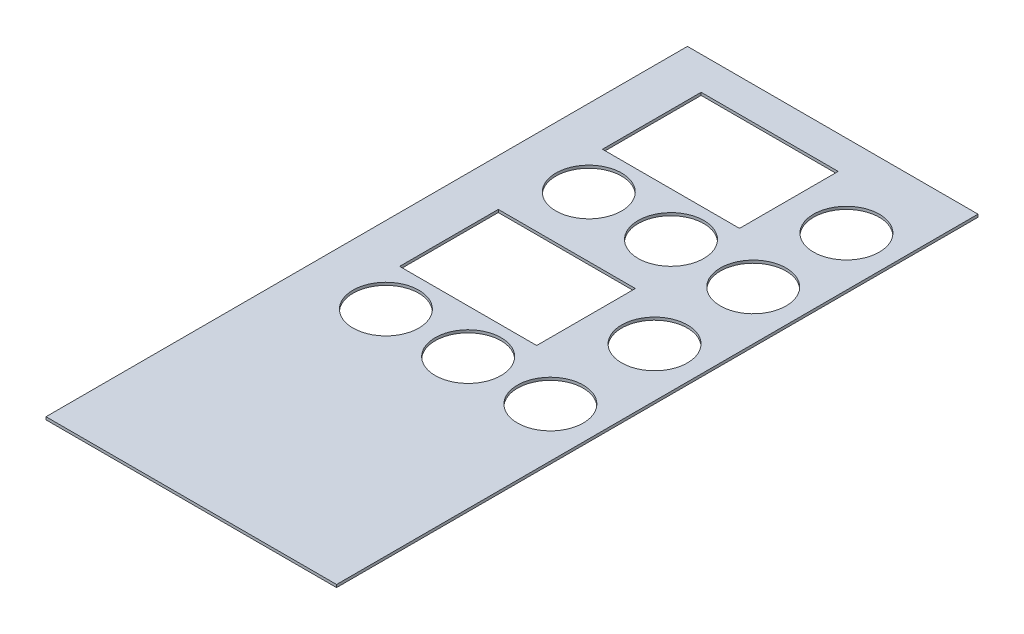
ISO-10303-21;
HEADER;
FILE_DESCRIPTION(('STEP AP214'),'2;1');
FILE_NAME('part.step','',(''),(''),'','','');
FILE_SCHEMA(('AUTOMOTIVE_DESIGN { 1 0 10303 214 1 1 1 1 }'));
ENDSEC;
DATA;
#1=APPLICATION_CONTEXT('core data for automotive mechanical design processes');
#2=APPLICATION_PROTOCOL_DEFINITION('international standard','automotive_design',2000,#1);
#3=PRODUCT_CONTEXT('',#1,'mechanical');
#4=PRODUCT('Part','Part','',(#3));
#5=PRODUCT_RELATED_PRODUCT_CATEGORY('part','',(#4));
#6=PRODUCT_DEFINITION_FORMATION('','',#4);
#7=PRODUCT_DEFINITION_CONTEXT('part definition',#1,'design');
#8=PRODUCT_DEFINITION('design','',#6,#7);
#9=PRODUCT_DEFINITION_SHAPE('','',#8);
#10=(LENGTH_UNIT() NAMED_UNIT(*) SI_UNIT(.MILLI.,.METRE.));
#11=(NAMED_UNIT(*) PLANE_ANGLE_UNIT() SI_UNIT($,.RADIAN.));
#12=(NAMED_UNIT(*) SI_UNIT($,.STERADIAN.) SOLID_ANGLE_UNIT());
#13=UNCERTAINTY_MEASURE_WITH_UNIT(LENGTH_MEASURE(1.E-05),#10,'distance_accuracy_value','');
#14=(GEOMETRIC_REPRESENTATION_CONTEXT(3) GLOBAL_UNCERTAINTY_ASSIGNED_CONTEXT((#13)) GLOBAL_UNIT_ASSIGNED_CONTEXT((#10,
#11,#12)) REPRESENTATION_CONTEXT('',''));
#15=CARTESIAN_POINT('',(0.,0.,0.));
#16=DIRECTION('',(0.,0.,1.));
#17=DIRECTION('',(1.,0.,0.));
#18=AXIS2_PLACEMENT_3D('',#15,#16,#17);
#19=CARTESIAN_POINT('',(26.5,0.5,58.5));
#20=DIRECTION('',(-1.,0.,0.));
#21=DIRECTION('',(0.,0.,1.));
#22=AXIS2_PLACEMENT_3D('',#19,#20,#21);
#23=PLANE('',#22);
#24=DIRECTION('',(0.,0.,-1.));
#25=VECTOR('',#24,1.);
#26=CARTESIAN_POINT('',(26.5,0.,58.5));
#27=LINE('',#26,#25);
#28=CARTESIAN_POINT('',(26.5,0.,58.5));
#29=VERTEX_POINT('',#28);
#30=CARTESIAN_POINT('',(26.5,0.,-58.5));
#31=VERTEX_POINT('',#30);
#32=EDGE_CURVE('E187',#29,#31,#27,.T.);
#33=ORIENTED_EDGE('',*,*,#32,.T.);
#34=DIRECTION('',(0.,-1.,0.));
#35=VECTOR('',#34,1.);
#36=CARTESIAN_POINT('',(26.5,0.5,-58.5));
#37=LINE('',#36,#35);
#38=CARTESIAN_POINT('',(26.5,0.5,-58.5));
#39=VERTEX_POINT('',#38);
#40=EDGE_CURVE('E11',#39,#31,#37,.T.);
#41=ORIENTED_EDGE('',*,*,#40,.F.);
#42=DIRECTION('',(0.,0.,-1.));
#43=VECTOR('',#42,1.);
#44=CARTESIAN_POINT('',(26.5,0.5,58.5));
#45=LINE('',#44,#43);
#46=CARTESIAN_POINT('',(26.5,0.5,58.5));
#47=VERTEX_POINT('',#46);
#48=EDGE_CURVE('E194',#47,#39,#45,.T.);
#49=ORIENTED_EDGE('',*,*,#48,.F.);
#50=DIRECTION('',(0.,-1.,0.));
#51=VECTOR('',#50,1.);
#52=CARTESIAN_POINT('',(26.5,0.5,58.5));
#53=LINE('',#52,#51);
#54=EDGE_CURVE('E204',#47,#29,#53,.T.);
#55=ORIENTED_EDGE('',*,*,#54,.T.);
#56=EDGE_LOOP('',(#33,#41,#49,#55));
#57=FACE_BOUND('',#56,.T.);
#58=ADVANCED_FACE('F33',(#57),#23,.F.);
#59=CARTESIAN_POINT('',(-26.5,0.5,-58.5));
#60=DIRECTION('',(0.,0.,1.));
#61=DIRECTION('',(1.,0.,0.));
#62=AXIS2_PLACEMENT_3D('',#59,#60,#61);
#63=PLANE('',#62);
#64=DIRECTION('',(-1.,0.,0.));
#65=VECTOR('',#64,1.);
#66=CARTESIAN_POINT('',(-26.5,0.,-58.5));
#67=LINE('',#66,#65);
#68=CARTESIAN_POINT('',(-26.5,0.,-58.5));
#69=VERTEX_POINT('',#68);
#70=EDGE_CURVE('E207',#31,#69,#67,.T.);
#71=ORIENTED_EDGE('',*,*,#70,.T.);
#72=DIRECTION('',(0.,-1.,0.));
#73=VECTOR('',#72,1.);
#74=CARTESIAN_POINT('',(-26.5,0.5,-58.5));
#75=LINE('',#74,#73);
#76=CARTESIAN_POINT('',(-26.5,0.5,-58.5));
#77=VERTEX_POINT('',#76);
#78=EDGE_CURVE('E40',#77,#69,#75,.T.);
#79=ORIENTED_EDGE('',*,*,#78,.F.);
#80=DIRECTION('',(-1.,0.,0.));
#81=VECTOR('',#80,1.);
#82=CARTESIAN_POINT('',(-26.5,0.5,-58.5));
#83=LINE('',#82,#81);
#84=EDGE_CURVE('E197',#39,#77,#83,.T.);
#85=ORIENTED_EDGE('',*,*,#84,.F.);
#86=ORIENTED_EDGE('',*,*,#40,.T.);
#87=EDGE_LOOP('',(#71,#79,#85,#86));
#88=FACE_BOUND('',#87,.T.);
#89=ADVANCED_FACE('F236',(#88),#63,.F.);
#90=CARTESIAN_POINT('',(-26.5,0.5,58.5));
#91=DIRECTION('',(1.,0.,0.));
#92=DIRECTION('',(0.,0.,-1.));
#93=AXIS2_PLACEMENT_3D('',#90,#91,#92);
#94=PLANE('',#93);
#95=DIRECTION('',(0.,0.,1.));
#96=VECTOR('',#95,1.);
#97=CARTESIAN_POINT('',(-26.5,0.,58.5));
#98=LINE('',#97,#96);
#99=CARTESIAN_POINT('',(-26.5,0.,58.5));
#100=VERTEX_POINT('',#99);
#101=EDGE_CURVE('E209',#69,#100,#98,.T.);
#102=ORIENTED_EDGE('',*,*,#101,.T.);
#103=DIRECTION('',(0.,-1.,0.));
#104=VECTOR('',#103,1.);
#105=CARTESIAN_POINT('',(-26.5,0.5,58.5));
#106=LINE('',#105,#104);
#107=CARTESIAN_POINT('',(-26.5,0.5,58.5));
#108=VERTEX_POINT('',#107);
#109=EDGE_CURVE('E214',#108,#100,#106,.T.);
#110=ORIENTED_EDGE('',*,*,#109,.F.);
#111=DIRECTION('',(0.,0.,1.));
#112=VECTOR('',#111,1.);
#113=CARTESIAN_POINT('',(-26.5,0.5,58.5));
#114=LINE('',#113,#112);
#115=EDGE_CURVE('E200',#77,#108,#114,.T.);
#116=ORIENTED_EDGE('',*,*,#115,.F.);
#117=ORIENTED_EDGE('',*,*,#78,.T.);
#118=EDGE_LOOP('',(#102,#110,#116,#117));
#119=FACE_BOUND('',#118,.T.);
#120=ADVANCED_FACE('F221',(#119),#94,.F.);
#121=CARTESIAN_POINT('',(-26.5,0.5,58.5));
#122=DIRECTION('',(0.,0.,-1.));
#123=DIRECTION('',(-1.,0.,0.));
#124=AXIS2_PLACEMENT_3D('',#121,#122,#123);
#125=PLANE('',#124);
#126=DIRECTION('',(1.,0.,0.));
#127=VECTOR('',#126,1.);
#128=CARTESIAN_POINT('',(-26.5,0.,58.5));
#129=LINE('',#128,#127);
#130=EDGE_CURVE('E198',#100,#29,#129,.T.);
#131=ORIENTED_EDGE('',*,*,#130,.T.);
#132=ORIENTED_EDGE('',*,*,#54,.F.);
#133=DIRECTION('',(1.,0.,0.));
#134=VECTOR('',#133,1.);
#135=CARTESIAN_POINT('',(-26.5,0.5,58.5));
#136=LINE('',#135,#134);
#137=EDGE_CURVE('E202',#108,#47,#136,.T.);
#138=ORIENTED_EDGE('',*,*,#137,.F.);
#139=ORIENTED_EDGE('',*,*,#109,.T.);
#140=EDGE_LOOP('',(#131,#132,#138,#139));
#141=FACE_BOUND('',#140,.T.);
#142=ADVANCED_FACE('F229',(#141),#125,.F.);
#143=CARTESIAN_POINT('',(26.5,0.5,-58.5));
#144=DIRECTION('',(0.,-1.,0.));
#145=DIRECTION('',(0.,0.,-1.));
#146=AXIS2_PLACEMENT_3D('',#143,#144,#145);
#147=PLANE('',#146);
#148=CARTESIAN_POINT('',(-12.5,0.5,10.5));
#149=DIRECTION('',(0.,1.,0.));
#150=DIRECTION('',(0.,0.,1.));
#151=AXIS2_PLACEMENT_3D('',#148,#149,#150);
#152=CIRCLE('',#151,6.);
#153=CARTESIAN_POINT('',(-12.5,0.5,16.5));
#154=VERTEX_POINT('',#153);
#155=EDGE_CURVE('E318',#154,#154,#152,.T.);
#156=ORIENTED_EDGE('',*,*,#155,.F.);
#157=EDGE_LOOP('',(#156));
#158=FACE_BOUND('',#157,.T.);
#159=CARTESIAN_POINT('',(2.50000000000001,0.5,10.5));
#160=DIRECTION('',(0.,1.,0.));
#161=DIRECTION('',(0.,0.,1.));
#162=AXIS2_PLACEMENT_3D('',#159,#160,#161);
#163=CIRCLE('',#162,6.);
#164=CARTESIAN_POINT('',(2.50000000000001,0.5,16.5));
#165=VERTEX_POINT('',#164);
#166=EDGE_CURVE('E320',#165,#165,#163,.T.);
#167=ORIENTED_EDGE('',*,*,#166,.F.);
#168=EDGE_LOOP('',(#167));
#169=FACE_BOUND('',#168,.T.);
#170=CARTESIAN_POINT('',(-12.5,0.5,-26.5));
#171=DIRECTION('',(0.,1.,0.));
#172=DIRECTION('',(0.,0.,1.));
#173=AXIS2_PLACEMENT_3D('',#170,#171,#172);
#174=CIRCLE('',#173,6.);
#175=CARTESIAN_POINT('',(-12.5,0.5,-20.5));
#176=VERTEX_POINT('',#175);
#177=EDGE_CURVE('E326',#176,#176,#174,.T.);
#178=ORIENTED_EDGE('',*,*,#177,.F.);
#179=EDGE_LOOP('',(#178));
#180=FACE_BOUND('',#179,.T.);
#181=CARTESIAN_POINT('',(2.50000000000001,0.5,-26.5));
#182=DIRECTION('',(0.,1.,0.));
#183=DIRECTION('',(0.,0.,1.));
#184=AXIS2_PLACEMENT_3D('',#181,#182,#183);
#185=CIRCLE('',#184,6.);
#186=CARTESIAN_POINT('',(2.50000000000001,0.5,-20.5));
#187=VERTEX_POINT('',#186);
#188=EDGE_CURVE('E332',#187,#187,#185,.T.);
#189=ORIENTED_EDGE('',*,*,#188,.F.);
#190=EDGE_LOOP('',(#189));
#191=FACE_BOUND('',#190,.T.);
#192=CARTESIAN_POINT('',(17.5,0.5,10.5));
#193=DIRECTION('',(0.,1.,0.));
#194=DIRECTION('',(0.,0.,1.));
#195=AXIS2_PLACEMENT_3D('',#192,#193,#194);
#196=CIRCLE('',#195,6.);
#197=CARTESIAN_POINT('',(17.5,0.5,16.5));
#198=VERTEX_POINT('',#197);
#199=EDGE_CURVE('E338',#198,#198,#196,.T.);
#200=ORIENTED_EDGE('',*,*,#199,.F.);
#201=EDGE_LOOP('',(#200));
#202=FACE_BOUND('',#201,.T.);
#203=CARTESIAN_POINT('',(17.5,0.5,-8.50000000000001));
#204=DIRECTION('',(0.,1.,0.));
#205=DIRECTION('',(0.,0.,1.));
#206=AXIS2_PLACEMENT_3D('',#203,#204,#205);
#207=CIRCLE('',#206,6.);
#208=CARTESIAN_POINT('',(17.5,0.5,-2.50000000000001));
#209=VERTEX_POINT('',#208);
#210=EDGE_CURVE('E344',#209,#209,#207,.T.);
#211=ORIENTED_EDGE('',*,*,#210,.F.);
#212=EDGE_LOOP('',(#211));
#213=FACE_BOUND('',#212,.T.);
#214=CARTESIAN_POINT('',(17.5,0.5,-26.5));
#215=DIRECTION('',(0.,1.,0.));
#216=DIRECTION('',(0.,0.,1.));
#217=AXIS2_PLACEMENT_3D('',#214,#215,#216);
#218=CIRCLE('',#217,6.);
#219=CARTESIAN_POINT('',(17.5,0.5,-20.5));
#220=VERTEX_POINT('',#219);
#221=EDGE_CURVE('E350',#220,#220,#218,.T.);
#222=ORIENTED_EDGE('',*,*,#221,.F.);
#223=EDGE_LOOP('',(#222));
#224=FACE_BOUND('',#223,.T.);
#225=CARTESIAN_POINT('',(17.5,0.5,-43.5));
#226=DIRECTION('',(0.,1.,0.));
#227=DIRECTION('',(0.,0.,1.));
#228=AXIS2_PLACEMENT_3D('',#225,#226,#227);
#229=CIRCLE('',#228,6.);
#230=CARTESIAN_POINT('',(17.5,0.5,-37.5));
#231=VERTEX_POINT('',#230);
#232=EDGE_CURVE('E145',#231,#231,#229,.T.);
#233=ORIENTED_EDGE('',*,*,#232,.F.);
#234=EDGE_LOOP('',(#233));
#235=FACE_BOUND('',#234,.T.);
#236=DIRECTION('',(-1.,0.,0.));
#237=VECTOR('',#236,1.);
#238=CARTESIAN_POINT('',(-18.,0.5,-15.5));
#239=LINE('',#238,#237);
#240=CARTESIAN_POINT('',(6.99999999999999,0.5,-15.5));
#241=VERTEX_POINT('',#240);
#242=CARTESIAN_POINT('',(-18.,0.5,-15.5));
#243=VERTEX_POINT('',#242);
#244=EDGE_CURVE('E151',#241,#243,#239,.T.);
#245=ORIENTED_EDGE('',*,*,#244,.F.);
#246=DIRECTION('',(0.,0.,-1.));
#247=VECTOR('',#246,1.);
#248=CARTESIAN_POINT('',(6.99999999999999,0.5,2.49999999999997));
#249=LINE('',#248,#247);
#250=CARTESIAN_POINT('',(6.99999999999999,0.5,2.49999999999997));
#251=VERTEX_POINT('',#250);
#252=EDGE_CURVE('E47',#251,#241,#249,.T.);
#253=ORIENTED_EDGE('',*,*,#252,.F.);
#254=DIRECTION('',(1.,0.,0.));
#255=VECTOR('',#254,1.);
#256=CARTESIAN_POINT('',(-18.,0.5,2.49999999999997));
#257=LINE('',#256,#255);
#258=CARTESIAN_POINT('',(-18.,0.5,2.49999999999997));
#259=VERTEX_POINT('',#258);
#260=EDGE_CURVE('E139',#259,#251,#257,.T.);
#261=ORIENTED_EDGE('',*,*,#260,.F.);
#262=DIRECTION('',(0.,0.,1.));
#263=VECTOR('',#262,1.);
#264=CARTESIAN_POINT('',(-18.,0.5,2.49999999999997));
#265=LINE('',#264,#263);
#266=EDGE_CURVE('E142',#243,#259,#265,.T.);
#267=ORIENTED_EDGE('',*,*,#266,.F.);
#268=EDGE_LOOP('',(#245,#253,#261,#267));
#269=FACE_BOUND('',#268,.T.);
#270=DIRECTION('',(-1.,0.,0.));
#271=VECTOR('',#270,1.);
#272=CARTESIAN_POINT('',(-18.,0.5,-52.5));
#273=LINE('',#272,#271);
#274=CARTESIAN_POINT('',(6.99999999999999,0.5,-52.5));
#275=VERTEX_POINT('',#274);
#276=CARTESIAN_POINT('',(-18.,0.5,-52.5));
#277=VERTEX_POINT('',#276);
#278=EDGE_CURVE('E177',#275,#277,#273,.T.);
#279=ORIENTED_EDGE('',*,*,#278,.F.);
#280=DIRECTION('',(0.,0.,-1.));
#281=VECTOR('',#280,1.);
#282=CARTESIAN_POINT('',(6.99999999999999,0.5,-52.5));
#283=LINE('',#282,#281);
#284=CARTESIAN_POINT('',(6.99999999999999,0.5,-34.5));
#285=VERTEX_POINT('',#284);
#286=EDGE_CURVE('E158',#285,#275,#283,.T.);
#287=ORIENTED_EDGE('',*,*,#286,.F.);
#288=DIRECTION('',(1.,0.,0.));
#289=VECTOR('',#288,1.);
#290=CARTESIAN_POINT('',(-18.,0.5,-34.5));
#291=LINE('',#290,#289);
#292=CARTESIAN_POINT('',(-18.,0.5,-34.5));
#293=VERTEX_POINT('',#292);
#294=EDGE_CURVE('E166',#293,#285,#291,.T.);
#295=ORIENTED_EDGE('',*,*,#294,.F.);
#296=DIRECTION('',(0.,0.,1.));
#297=VECTOR('',#296,1.);
#298=CARTESIAN_POINT('',(-18.,0.5,-52.5));
#299=LINE('',#298,#297);
#300=EDGE_CURVE('E180',#277,#293,#299,.T.);
#301=ORIENTED_EDGE('',*,*,#300,.F.);
#302=EDGE_LOOP('',(#279,#287,#295,#301));
#303=FACE_BOUND('',#302,.T.);
#304=ORIENTED_EDGE('',*,*,#48,.T.);
#305=ORIENTED_EDGE('',*,*,#84,.T.);
#306=ORIENTED_EDGE('',*,*,#115,.T.);
#307=ORIENTED_EDGE('',*,*,#137,.T.);
#308=EDGE_LOOP('',(#304,#305,#306,#307));
#309=FACE_BOUND('',#308,.T.);
#310=ADVANCED_FACE('F235',(#158,#169,#180,#191,#202,#213,#224,#235,#269,#303,#309),#147,.F.);
#311=CARTESIAN_POINT('',(26.5,0.,-58.5));
#312=DIRECTION('',(0.,-1.,0.));
#313=DIRECTION('',(0.,0.,-1.));
#314=AXIS2_PLACEMENT_3D('',#311,#312,#313);
#315=PLANE('',#314);
#316=CARTESIAN_POINT('',(-12.5,0.,10.5));
#317=DIRECTION('',(0.,1.,0.));
#318=DIRECTION('',(0.,0.,1.));
#319=AXIS2_PLACEMENT_3D('',#316,#317,#318);
#320=CIRCLE('',#319,6.);
#321=CARTESIAN_POINT('',(-12.5,0.,16.5));
#322=VERTEX_POINT('',#321);
#323=EDGE_CURVE('E315',#322,#322,#320,.T.);
#324=ORIENTED_EDGE('',*,*,#323,.T.);
#325=EDGE_LOOP('',(#324));
#326=FACE_BOUND('',#325,.T.);
#327=CARTESIAN_POINT('',(2.50000000000001,0.,10.5));
#328=DIRECTION('',(0.,1.,0.));
#329=DIRECTION('',(0.,0.,1.));
#330=AXIS2_PLACEMENT_3D('',#327,#328,#329);
#331=CIRCLE('',#330,6.);
#332=CARTESIAN_POINT('',(2.50000000000001,0.,16.5));
#333=VERTEX_POINT('',#332);
#334=EDGE_CURVE('E323',#333,#333,#331,.T.);
#335=ORIENTED_EDGE('',*,*,#334,.T.);
#336=EDGE_LOOP('',(#335));
#337=FACE_BOUND('',#336,.T.);
#338=CARTESIAN_POINT('',(-12.5,0.,-26.5));
#339=DIRECTION('',(0.,1.,0.));
#340=DIRECTION('',(0.,0.,1.));
#341=AXIS2_PLACEMENT_3D('',#338,#339,#340);
#342=CIRCLE('',#341,6.);
#343=CARTESIAN_POINT('',(-12.5,0.,-20.5));
#344=VERTEX_POINT('',#343);
#345=EDGE_CURVE('E329',#344,#344,#342,.T.);
#346=ORIENTED_EDGE('',*,*,#345,.T.);
#347=EDGE_LOOP('',(#346));
#348=FACE_BOUND('',#347,.T.);
#349=CARTESIAN_POINT('',(2.50000000000001,0.,-26.5));
#350=DIRECTION('',(0.,1.,0.));
#351=DIRECTION('',(0.,0.,1.));
#352=AXIS2_PLACEMENT_3D('',#349,#350,#351);
#353=CIRCLE('',#352,6.);
#354=CARTESIAN_POINT('',(2.50000000000001,0.,-20.5));
#355=VERTEX_POINT('',#354);
#356=EDGE_CURVE('E335',#355,#355,#353,.T.);
#357=ORIENTED_EDGE('',*,*,#356,.T.);
#358=EDGE_LOOP('',(#357));
#359=FACE_BOUND('',#358,.T.);
#360=CARTESIAN_POINT('',(17.5,0.,10.5));
#361=DIRECTION('',(0.,1.,0.));
#362=DIRECTION('',(0.,0.,1.));
#363=AXIS2_PLACEMENT_3D('',#360,#361,#362);
#364=CIRCLE('',#363,6.);
#365=CARTESIAN_POINT('',(17.5,0.,16.5));
#366=VERTEX_POINT('',#365);
#367=EDGE_CURVE('E341',#366,#366,#364,.T.);
#368=ORIENTED_EDGE('',*,*,#367,.T.);
#369=EDGE_LOOP('',(#368));
#370=FACE_BOUND('',#369,.T.);
#371=CARTESIAN_POINT('',(17.5,0.,-8.50000000000001));
#372=DIRECTION('',(0.,1.,0.));
#373=DIRECTION('',(0.,0.,1.));
#374=AXIS2_PLACEMENT_3D('',#371,#372,#373);
#375=CIRCLE('',#374,6.);
#376=CARTESIAN_POINT('',(17.5,0.,-2.50000000000001));
#377=VERTEX_POINT('',#376);
#378=EDGE_CURVE('E347',#377,#377,#375,.T.);
#379=ORIENTED_EDGE('',*,*,#378,.T.);
#380=EDGE_LOOP('',(#379));
#381=FACE_BOUND('',#380,.T.);
#382=CARTESIAN_POINT('',(17.5,0.,-26.5));
#383=DIRECTION('',(0.,1.,0.));
#384=DIRECTION('',(0.,0.,1.));
#385=AXIS2_PLACEMENT_3D('',#382,#383,#384);
#386=CIRCLE('',#385,6.);
#387=CARTESIAN_POINT('',(17.5,0.,-20.5));
#388=VERTEX_POINT('',#387);
#389=EDGE_CURVE('E353',#388,#388,#386,.T.);
#390=ORIENTED_EDGE('',*,*,#389,.T.);
#391=EDGE_LOOP('',(#390));
#392=FACE_BOUND('',#391,.T.);
#393=CARTESIAN_POINT('',(17.5,0.,-43.5));
#394=DIRECTION('',(0.,1.,0.));
#395=DIRECTION('',(0.,0.,1.));
#396=AXIS2_PLACEMENT_3D('',#393,#394,#395);
#397=CIRCLE('',#396,6.);
#398=CARTESIAN_POINT('',(17.5,0.,-37.5));
#399=VERTEX_POINT('',#398);
#400=EDGE_CURVE('E152',#399,#399,#397,.T.);
#401=ORIENTED_EDGE('',*,*,#400,.T.);
#402=EDGE_LOOP('',(#401));
#403=FACE_BOUND('',#402,.T.);
#404=DIRECTION('',(0.,0.,-1.));
#405=VECTOR('',#404,1.);
#406=CARTESIAN_POINT('',(6.99999999999999,0.,2.49999999999997));
#407=LINE('',#406,#405);
#408=CARTESIAN_POINT('',(6.99999999999999,0.,2.49999999999997));
#409=VERTEX_POINT('',#408);
#410=CARTESIAN_POINT('',(6.99999999999999,0.,-15.5));
#411=VERTEX_POINT('',#410);
#412=EDGE_CURVE('E123',#409,#411,#407,.T.);
#413=ORIENTED_EDGE('',*,*,#412,.T.);
#414=DIRECTION('',(-1.,0.,0.));
#415=VECTOR('',#414,1.);
#416=CARTESIAN_POINT('',(-18.,0.,-15.5));
#417=LINE('',#416,#415);
#418=CARTESIAN_POINT('',(-18.,0.,-15.5));
#419=VERTEX_POINT('',#418);
#420=EDGE_CURVE('E132',#411,#419,#417,.T.);
#421=ORIENTED_EDGE('',*,*,#420,.T.);
#422=DIRECTION('',(0.,0.,1.));
#423=VECTOR('',#422,1.);
#424=CARTESIAN_POINT('',(-18.,0.,2.49999999999997));
#425=LINE('',#424,#423);
#426=CARTESIAN_POINT('',(-18.,0.,2.49999999999997));
#427=VERTEX_POINT('',#426);
#428=EDGE_CURVE('E55',#419,#427,#425,.T.);
#429=ORIENTED_EDGE('',*,*,#428,.T.);
#430=DIRECTION('',(1.,0.,0.));
#431=VECTOR('',#430,1.);
#432=CARTESIAN_POINT('',(-18.,0.,2.49999999999997));
#433=LINE('',#432,#431);
#434=EDGE_CURVE('E129',#427,#409,#433,.T.);
#435=ORIENTED_EDGE('',*,*,#434,.T.);
#436=EDGE_LOOP('',(#413,#421,#429,#435));
#437=FACE_BOUND('',#436,.T.);
#438=DIRECTION('',(0.,0.,-1.));
#439=VECTOR('',#438,1.);
#440=CARTESIAN_POINT('',(6.99999999999999,0.,-52.5));
#441=LINE('',#440,#439);
#442=CARTESIAN_POINT('',(6.99999999999999,0.,-34.5));
#443=VERTEX_POINT('',#442);
#444=CARTESIAN_POINT('',(6.99999999999999,0.,-52.5));
#445=VERTEX_POINT('',#444);
#446=EDGE_CURVE('E162',#443,#445,#441,.T.);
#447=ORIENTED_EDGE('',*,*,#446,.T.);
#448=DIRECTION('',(-1.,0.,0.));
#449=VECTOR('',#448,1.);
#450=CARTESIAN_POINT('',(-18.,0.,-52.5));
#451=LINE('',#450,#449);
#452=CARTESIAN_POINT('',(-18.,0.,-52.5));
#453=VERTEX_POINT('',#452);
#454=EDGE_CURVE('E165',#445,#453,#451,.T.);
#455=ORIENTED_EDGE('',*,*,#454,.T.);
#456=DIRECTION('',(0.,0.,1.));
#457=VECTOR('',#456,1.);
#458=CARTESIAN_POINT('',(-18.,0.,-52.5));
#459=LINE('',#458,#457);
#460=CARTESIAN_POINT('',(-18.,0.,-34.5));
#461=VERTEX_POINT('',#460);
#462=EDGE_CURVE('E169',#453,#461,#459,.T.);
#463=ORIENTED_EDGE('',*,*,#462,.T.);
#464=DIRECTION('',(1.,0.,0.));
#465=VECTOR('',#464,1.);
#466=CARTESIAN_POINT('',(-18.,0.,-34.5));
#467=LINE('',#466,#465);
#468=EDGE_CURVE('E172',#461,#443,#467,.T.);
#469=ORIENTED_EDGE('',*,*,#468,.T.);
#470=EDGE_LOOP('',(#447,#455,#463,#469));
#471=FACE_BOUND('',#470,.T.);
#472=ORIENTED_EDGE('',*,*,#32,.F.);
#473=ORIENTED_EDGE('',*,*,#130,.F.);
#474=ORIENTED_EDGE('',*,*,#101,.F.);
#475=ORIENTED_EDGE('',*,*,#70,.F.);
#476=EDGE_LOOP('',(#472,#473,#474,#475));
#477=FACE_BOUND('',#476,.T.);
#478=ADVANCED_FACE('F136',(#326,#337,#348,#359,#370,#381,#392,#403,#437,#471,#477),#315,.T.);
#479=CARTESIAN_POINT('',(6.99999999999999,0.,-52.5));
#480=DIRECTION('',(1.,0.,0.));
#481=DIRECTION('',(0.,0.,-1.));
#482=AXIS2_PLACEMENT_3D('',#479,#480,#481);
#483=PLANE('',#482);
#484=ORIENTED_EDGE('',*,*,#286,.T.);
#485=DIRECTION('',(0.,1.,0.));
#486=VECTOR('',#485,1.);
#487=CARTESIAN_POINT('',(6.99999999999999,0.,-52.5));
#488=LINE('',#487,#486);
#489=EDGE_CURVE('E175',#445,#275,#488,.T.);
#490=ORIENTED_EDGE('',*,*,#489,.F.);
#491=ORIENTED_EDGE('',*,*,#446,.F.);
#492=DIRECTION('',(0.,1.,0.));
#493=VECTOR('',#492,1.);
#494=CARTESIAN_POINT('',(6.99999999999999,0.,-34.5));
#495=LINE('',#494,#493);
#496=EDGE_CURVE('E185',#443,#285,#495,.T.);
#497=ORIENTED_EDGE('',*,*,#496,.T.);
#498=EDGE_LOOP('',(#484,#490,#491,#497));
#499=FACE_BOUND('',#498,.T.);
#500=ADVANCED_FACE('F248',(#499),#483,.F.);
#501=CARTESIAN_POINT('',(-18.,0.,-34.5));
#502=DIRECTION('',(0.,0.,1.));
#503=DIRECTION('',(1.,0.,0.));
#504=AXIS2_PLACEMENT_3D('',#501,#502,#503);
#505=PLANE('',#504);
#506=ORIENTED_EDGE('',*,*,#294,.T.);
#507=ORIENTED_EDGE('',*,*,#496,.F.);
#508=ORIENTED_EDGE('',*,*,#468,.F.);
#509=DIRECTION('',(0.,1.,0.));
#510=VECTOR('',#509,1.);
#511=CARTESIAN_POINT('',(-18.,0.,-34.5));
#512=LINE('',#511,#510);
#513=EDGE_CURVE('E188',#461,#293,#512,.T.);
#514=ORIENTED_EDGE('',*,*,#513,.T.);
#515=EDGE_LOOP('',(#506,#507,#508,#514));
#516=FACE_BOUND('',#515,.T.);
#517=ADVANCED_FACE('F255',(#516),#505,.F.);
#518=CARTESIAN_POINT('',(-18.,0.,-52.5));
#519=DIRECTION('',(-1.,0.,0.));
#520=DIRECTION('',(0.,0.,1.));
#521=AXIS2_PLACEMENT_3D('',#518,#519,#520);
#522=PLANE('',#521);
#523=ORIENTED_EDGE('',*,*,#300,.T.);
#524=ORIENTED_EDGE('',*,*,#513,.F.);
#525=ORIENTED_EDGE('',*,*,#462,.F.);
#526=DIRECTION('',(0.,1.,0.));
#527=VECTOR('',#526,1.);
#528=CARTESIAN_POINT('',(-18.,0.,-52.5));
#529=LINE('',#528,#527);
#530=EDGE_CURVE('E190',#453,#277,#529,.T.);
#531=ORIENTED_EDGE('',*,*,#530,.T.);
#532=EDGE_LOOP('',(#523,#524,#525,#531));
#533=FACE_BOUND('',#532,.T.);
#534=ADVANCED_FACE('F260',(#533),#522,.F.);
#535=CARTESIAN_POINT('',(-18.,0.,-52.5));
#536=DIRECTION('',(0.,0.,-1.));
#537=DIRECTION('',(-1.,0.,0.));
#538=AXIS2_PLACEMENT_3D('',#535,#536,#537);
#539=PLANE('',#538);
#540=ORIENTED_EDGE('',*,*,#278,.T.);
#541=ORIENTED_EDGE('',*,*,#530,.F.);
#542=ORIENTED_EDGE('',*,*,#454,.F.);
#543=ORIENTED_EDGE('',*,*,#489,.T.);
#544=EDGE_LOOP('',(#540,#541,#542,#543));
#545=FACE_BOUND('',#544,.T.);
#546=ADVANCED_FACE('F257',(#545),#539,.F.);
#547=CARTESIAN_POINT('',(6.99999999999999,0.,2.49999999999997));
#548=DIRECTION('',(1.,0.,0.));
#549=DIRECTION('',(0.,0.,-1.));
#550=AXIS2_PLACEMENT_3D('',#547,#548,#549);
#551=PLANE('',#550);
#552=ORIENTED_EDGE('',*,*,#252,.T.);
#553=DIRECTION('',(0.,1.,0.));
#554=VECTOR('',#553,1.);
#555=CARTESIAN_POINT('',(6.99999999999999,0.,-15.5));
#556=LINE('',#555,#554);
#557=EDGE_CURVE('E119',#411,#241,#556,.T.);
#558=ORIENTED_EDGE('',*,*,#557,.F.);
#559=ORIENTED_EDGE('',*,*,#412,.F.);
#560=DIRECTION('',(0.,1.,0.));
#561=VECTOR('',#560,1.);
#562=CARTESIAN_POINT('',(6.99999999999999,0.,2.49999999999997));
#563=LINE('',#562,#561);
#564=EDGE_CURVE('E156',#409,#251,#563,.T.);
#565=ORIENTED_EDGE('',*,*,#564,.T.);
#566=EDGE_LOOP('',(#552,#558,#559,#565));
#567=FACE_BOUND('',#566,.T.);
#568=ADVANCED_FACE('F121',(#567),#551,.F.);
#569=CARTESIAN_POINT('',(-18.,0.,2.49999999999997));
#570=DIRECTION('',(0.,0.,1.));
#571=DIRECTION('',(1.,0.,0.));
#572=AXIS2_PLACEMENT_3D('',#569,#570,#571);
#573=PLANE('',#572);
#574=ORIENTED_EDGE('',*,*,#260,.T.);
#575=ORIENTED_EDGE('',*,*,#564,.F.);
#576=ORIENTED_EDGE('',*,*,#434,.F.);
#577=DIRECTION('',(0.,1.,0.));
#578=VECTOR('',#577,1.);
#579=CARTESIAN_POINT('',(-18.,0.,2.49999999999997));
#580=LINE('',#579,#578);
#581=EDGE_CURVE('E159',#427,#259,#580,.T.);
#582=ORIENTED_EDGE('',*,*,#581,.T.);
#583=EDGE_LOOP('',(#574,#575,#576,#582));
#584=FACE_BOUND('',#583,.T.);
#585=ADVANCED_FACE('F270',(#584),#573,.F.);
#586=CARTESIAN_POINT('',(-18.,0.,2.49999999999997));
#587=DIRECTION('',(-1.,0.,0.));
#588=DIRECTION('',(0.,0.,1.));
#589=AXIS2_PLACEMENT_3D('',#586,#587,#588);
#590=PLANE('',#589);
#591=ORIENTED_EDGE('',*,*,#266,.T.);
#592=ORIENTED_EDGE('',*,*,#581,.F.);
#593=ORIENTED_EDGE('',*,*,#428,.F.);
#594=DIRECTION('',(0.,1.,0.));
#595=VECTOR('',#594,1.);
#596=CARTESIAN_POINT('',(-18.,0.,-15.5));
#597=LINE('',#596,#595);
#598=EDGE_CURVE('E128',#419,#243,#597,.T.);
#599=ORIENTED_EDGE('',*,*,#598,.T.);
#600=EDGE_LOOP('',(#591,#592,#593,#599));
#601=FACE_BOUND('',#600,.T.);
#602=ADVANCED_FACE('F274',(#601),#590,.F.);
#603=CARTESIAN_POINT('',(-18.,0.,-15.5));
#604=DIRECTION('',(0.,0.,-1.));
#605=DIRECTION('',(-1.,0.,0.));
#606=AXIS2_PLACEMENT_3D('',#603,#604,#605);
#607=PLANE('',#606);
#608=ORIENTED_EDGE('',*,*,#244,.T.);
#609=ORIENTED_EDGE('',*,*,#598,.F.);
#610=ORIENTED_EDGE('',*,*,#420,.F.);
#611=ORIENTED_EDGE('',*,*,#557,.T.);
#612=EDGE_LOOP('',(#608,#609,#610,#611));
#613=FACE_BOUND('',#612,.T.);
#614=ADVANCED_FACE('F133',(#613),#607,.F.);
#615=CARTESIAN_POINT('',(17.5,0.,-43.5));
#616=DIRECTION('',(0.,1.,0.));
#617=DIRECTION('',(0.,0.,1.));
#618=AXIS2_PLACEMENT_3D('',#615,#616,#617);
#619=CYLINDRICAL_SURFACE('',#618,6.);
#620=ORIENTED_EDGE('',*,*,#400,.F.);
#621=EDGE_LOOP('',(#620));
#622=FACE_BOUND('',#621,.T.);
#623=ORIENTED_EDGE('',*,*,#232,.T.);
#624=EDGE_LOOP('',(#623));
#625=FACE_BOUND('',#624,.T.);
#626=ADVANCED_FACE('F273',(#622,#625),#619,.F.);
#627=CARTESIAN_POINT('',(17.5,0.,-26.5));
#628=DIRECTION('',(0.,1.,0.));
#629=DIRECTION('',(0.,0.,1.));
#630=AXIS2_PLACEMENT_3D('',#627,#628,#629);
#631=CYLINDRICAL_SURFACE('',#630,6.);
#632=ORIENTED_EDGE('',*,*,#389,.F.);
#633=EDGE_LOOP('',(#632));
#634=FACE_BOUND('',#633,.T.);
#635=ORIENTED_EDGE('',*,*,#221,.T.);
#636=EDGE_LOOP('',(#635));
#637=FACE_BOUND('',#636,.T.);
#638=ADVANCED_FACE('F282',(#634,#637),#631,.F.);
#639=CARTESIAN_POINT('',(17.5,0.,-8.50000000000001));
#640=DIRECTION('',(0.,1.,0.));
#641=DIRECTION('',(0.,0.,1.));
#642=AXIS2_PLACEMENT_3D('',#639,#640,#641);
#643=CYLINDRICAL_SURFACE('',#642,6.);
#644=ORIENTED_EDGE('',*,*,#378,.F.);
#645=EDGE_LOOP('',(#644));
#646=FACE_BOUND('',#645,.T.);
#647=ORIENTED_EDGE('',*,*,#210,.T.);
#648=EDGE_LOOP('',(#647));
#649=FACE_BOUND('',#648,.T.);
#650=ADVANCED_FACE('F286',(#646,#649),#643,.F.);
#651=CARTESIAN_POINT('',(17.5,0.,10.5));
#652=DIRECTION('',(0.,1.,0.));
#653=DIRECTION('',(0.,0.,1.));
#654=AXIS2_PLACEMENT_3D('',#651,#652,#653);
#655=CYLINDRICAL_SURFACE('',#654,6.);
#656=ORIENTED_EDGE('',*,*,#367,.F.);
#657=EDGE_LOOP('',(#656));
#658=FACE_BOUND('',#657,.T.);
#659=ORIENTED_EDGE('',*,*,#199,.T.);
#660=EDGE_LOOP('',(#659));
#661=FACE_BOUND('',#660,.T.);
#662=ADVANCED_FACE('F290',(#658,#661),#655,.F.);
#663=CARTESIAN_POINT('',(2.50000000000001,0.,-26.5));
#664=DIRECTION('',(0.,1.,0.));
#665=DIRECTION('',(0.,0.,1.));
#666=AXIS2_PLACEMENT_3D('',#663,#664,#665);
#667=CYLINDRICAL_SURFACE('',#666,6.);
#668=ORIENTED_EDGE('',*,*,#356,.F.);
#669=EDGE_LOOP('',(#668));
#670=FACE_BOUND('',#669,.T.);
#671=ORIENTED_EDGE('',*,*,#188,.T.);
#672=EDGE_LOOP('',(#671));
#673=FACE_BOUND('',#672,.T.);
#674=ADVANCED_FACE('F294',(#670,#673),#667,.F.);
#675=CARTESIAN_POINT('',(-12.5,0.,-26.5));
#676=DIRECTION('',(0.,1.,0.));
#677=DIRECTION('',(0.,0.,1.));
#678=AXIS2_PLACEMENT_3D('',#675,#676,#677);
#679=CYLINDRICAL_SURFACE('',#678,6.);
#680=ORIENTED_EDGE('',*,*,#345,.F.);
#681=EDGE_LOOP('',(#680));
#682=FACE_BOUND('',#681,.T.);
#683=ORIENTED_EDGE('',*,*,#177,.T.);
#684=EDGE_LOOP('',(#683));
#685=FACE_BOUND('',#684,.T.);
#686=ADVANCED_FACE('F298',(#682,#685),#679,.F.);
#687=CARTESIAN_POINT('',(2.50000000000001,0.,10.5));
#688=DIRECTION('',(0.,1.,0.));
#689=DIRECTION('',(0.,0.,1.));
#690=AXIS2_PLACEMENT_3D('',#687,#688,#689);
#691=CYLINDRICAL_SURFACE('',#690,6.);
#692=ORIENTED_EDGE('',*,*,#334,.F.);
#693=EDGE_LOOP('',(#692));
#694=FACE_BOUND('',#693,.T.);
#695=ORIENTED_EDGE('',*,*,#166,.T.);
#696=EDGE_LOOP('',(#695));
#697=FACE_BOUND('',#696,.T.);
#698=ADVANCED_FACE('F302',(#694,#697),#691,.F.);
#699=CARTESIAN_POINT('',(-12.5,0.,10.5));
#700=DIRECTION('',(0.,1.,0.));
#701=DIRECTION('',(0.,0.,1.));
#702=AXIS2_PLACEMENT_3D('',#699,#700,#701);
#703=CYLINDRICAL_SURFACE('',#702,6.);
#704=ORIENTED_EDGE('',*,*,#323,.F.);
#705=EDGE_LOOP('',(#704));
#706=FACE_BOUND('',#705,.T.);
#707=ORIENTED_EDGE('',*,*,#155,.T.);
#708=EDGE_LOOP('',(#707));
#709=FACE_BOUND('',#708,.T.);
#710=ADVANCED_FACE('F306',(#706,#709),#703,.F.);
#711=CLOSED_SHELL('',(#58,#89,#120,#142,#310,#478,#500,#517,#534,#546,#568,#585,#602,#614,#626,
#638,#650,#662,#674,#686,#698,#710));
#712=MANIFOLD_SOLID_BREP('B2',#711);
#713=ADVANCED_BREP_SHAPE_REPRESENTATION('',(#18,#712),#14);
#714=SHAPE_DEFINITION_REPRESENTATION(#9,#713);
ENDSEC;
END-ISO-10303-21;
